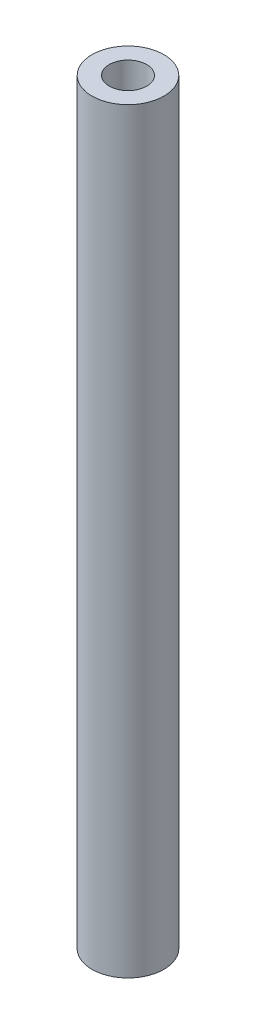
ISO-10303-21;
HEADER;
FILE_DESCRIPTION(('STEP AP214'),'2;1');
FILE_NAME('part.step','',(''),(''),'','','');
FILE_SCHEMA(('AUTOMOTIVE_DESIGN { 1 0 10303 214 1 1 1 1 }'));
ENDSEC;
DATA;
#1=APPLICATION_CONTEXT('core data for automotive mechanical design processes');
#2=APPLICATION_PROTOCOL_DEFINITION('international standard','automotive_design',2000,#1);
#3=PRODUCT_CONTEXT('',#1,'mechanical');
#4=PRODUCT('Part','Part','',(#3));
#5=PRODUCT_RELATED_PRODUCT_CATEGORY('part','',(#4));
#6=PRODUCT_DEFINITION_FORMATION('','',#4);
#7=PRODUCT_DEFINITION_CONTEXT('part definition',#1,'design');
#8=PRODUCT_DEFINITION('design','',#6,#7);
#9=PRODUCT_DEFINITION_SHAPE('','',#8);
#10=(LENGTH_UNIT() NAMED_UNIT(*) SI_UNIT(.MILLI.,.METRE.));
#11=(NAMED_UNIT(*) PLANE_ANGLE_UNIT() SI_UNIT($,.RADIAN.));
#12=(NAMED_UNIT(*) SI_UNIT($,.STERADIAN.) SOLID_ANGLE_UNIT());
#13=UNCERTAINTY_MEASURE_WITH_UNIT(LENGTH_MEASURE(1.E-05),#10,'distance_accuracy_value','');
#14=(GEOMETRIC_REPRESENTATION_CONTEXT(3) GLOBAL_UNCERTAINTY_ASSIGNED_CONTEXT((#13)) GLOBAL_UNIT_ASSIGNED_CONTEXT((#10,
#11,#12)) REPRESENTATION_CONTEXT('',''));
#15=CARTESIAN_POINT('',(0.,0.,0.));
#16=DIRECTION('',(0.,0.,1.));
#17=DIRECTION('',(1.,0.,0.));
#18=AXIS2_PLACEMENT_3D('',#15,#16,#17);
#19=CARTESIAN_POINT('',(0.,242.,0.));
#20=DIRECTION('',(0.,1.,0.));
#21=DIRECTION('',(0.,0.,1.));
#22=AXIS2_PLACEMENT_3D('',#19,#20,#21);
#23=PLANE('',#22);
#24=CARTESIAN_POINT('',(0.,242.,0.));
#25=DIRECTION('',(0.,1.,0.));
#26=DIRECTION('',(0.,0.,1.));
#27=AXIS2_PLACEMENT_3D('',#24,#25,#26);
#28=CIRCLE('',#27,11.5);
#29=CARTESIAN_POINT('',(0.,242.,11.5));
#30=VERTEX_POINT('',#29);
#31=EDGE_CURVE('E10',#30,#30,#28,.T.);
#32=ORIENTED_EDGE('',*,*,#31,.T.);
#33=EDGE_LOOP('',(#32));
#34=FACE_BOUND('',#33,.T.);
#35=CARTESIAN_POINT('',(0.,242.,0.));
#36=DIRECTION('',(0.,1.,0.));
#37=DIRECTION('',(0.,0.,1.));
#38=AXIS2_PLACEMENT_3D('',#35,#36,#37);
#39=CIRCLE('',#38,6.);
#40=CARTESIAN_POINT('',(0.,242.,6.));
#41=VERTEX_POINT('',#40);
#42=EDGE_CURVE('E42',#41,#41,#39,.T.);
#43=ORIENTED_EDGE('',*,*,#42,.F.);
#44=EDGE_LOOP('',(#43));
#45=FACE_BOUND('',#44,.T.);
#46=ADVANCED_FACE('F31',(#34,#45),#23,.T.);
#47=CARTESIAN_POINT('',(0.,0.,0.));
#48=DIRECTION('',(0.,1.,0.));
#49=DIRECTION('',(0.,0.,1.));
#50=AXIS2_PLACEMENT_3D('',#47,#48,#49);
#51=PLANE('',#50);
#52=CARTESIAN_POINT('',(0.,0.,0.));
#53=DIRECTION('',(0.,1.,0.));
#54=DIRECTION('',(0.,0.,1.));
#55=AXIS2_PLACEMENT_3D('',#52,#53,#54);
#56=CIRCLE('',#55,11.5);
#57=CARTESIAN_POINT('',(0.,0.,11.5));
#58=VERTEX_POINT('',#57);
#59=EDGE_CURVE('E35',#58,#58,#56,.T.);
#60=ORIENTED_EDGE('',*,*,#59,.F.);
#61=EDGE_LOOP('',(#60));
#62=FACE_BOUND('',#61,.T.);
#63=CARTESIAN_POINT('',(0.,0.,0.));
#64=DIRECTION('',(0.,1.,0.));
#65=DIRECTION('',(0.,0.,1.));
#66=AXIS2_PLACEMENT_3D('',#63,#64,#65);
#67=CIRCLE('',#66,6.);
#68=CARTESIAN_POINT('',(0.,0.,6.));
#69=VERTEX_POINT('',#68);
#70=EDGE_CURVE('E44',#69,#69,#67,.T.);
#71=ORIENTED_EDGE('',*,*,#70,.T.);
#72=EDGE_LOOP('',(#71));
#73=FACE_BOUND('',#72,.T.);
#74=ADVANCED_FACE('F54',(#62,#73),#51,.F.);
#75=CARTESIAN_POINT('',(0.,242.,0.));
#76=DIRECTION('',(0.,-1.,0.));
#77=DIRECTION('',(0.,0.,-1.));
#78=AXIS2_PLACEMENT_3D('',#75,#76,#77);
#79=CYLINDRICAL_SURFACE('',#78,11.5);
#80=ORIENTED_EDGE('',*,*,#31,.F.);
#81=EDGE_LOOP('',(#80));
#82=FACE_BOUND('',#81,.T.);
#83=ORIENTED_EDGE('',*,*,#59,.T.);
#84=EDGE_LOOP('',(#83));
#85=FACE_BOUND('',#84,.T.);
#86=ADVANCED_FACE('F33',(#82,#85),#79,.T.);
#87=CARTESIAN_POINT('',(0.,242.,0.));
#88=DIRECTION('',(0.,-1.,0.));
#89=DIRECTION('',(0.,0.,-1.));
#90=AXIS2_PLACEMENT_3D('',#87,#88,#89);
#91=CYLINDRICAL_SURFACE('',#90,6.);
#92=ORIENTED_EDGE('',*,*,#42,.T.);
#93=EDGE_LOOP('',(#92));
#94=FACE_BOUND('',#93,.T.);
#95=ORIENTED_EDGE('',*,*,#70,.F.);
#96=EDGE_LOOP('',(#95));
#97=FACE_BOUND('',#96,.T.);
#98=ADVANCED_FACE('F50',(#94,#97),#91,.F.);
#99=CLOSED_SHELL('',(#46,#74,#86,#98));
#100=MANIFOLD_SOLID_BREP('B2',#99);
#101=ADVANCED_BREP_SHAPE_REPRESENTATION('',(#18,#100),#14);
#102=SHAPE_DEFINITION_REPRESENTATION(#9,#101);
ENDSEC;
END-ISO-10303-21;
